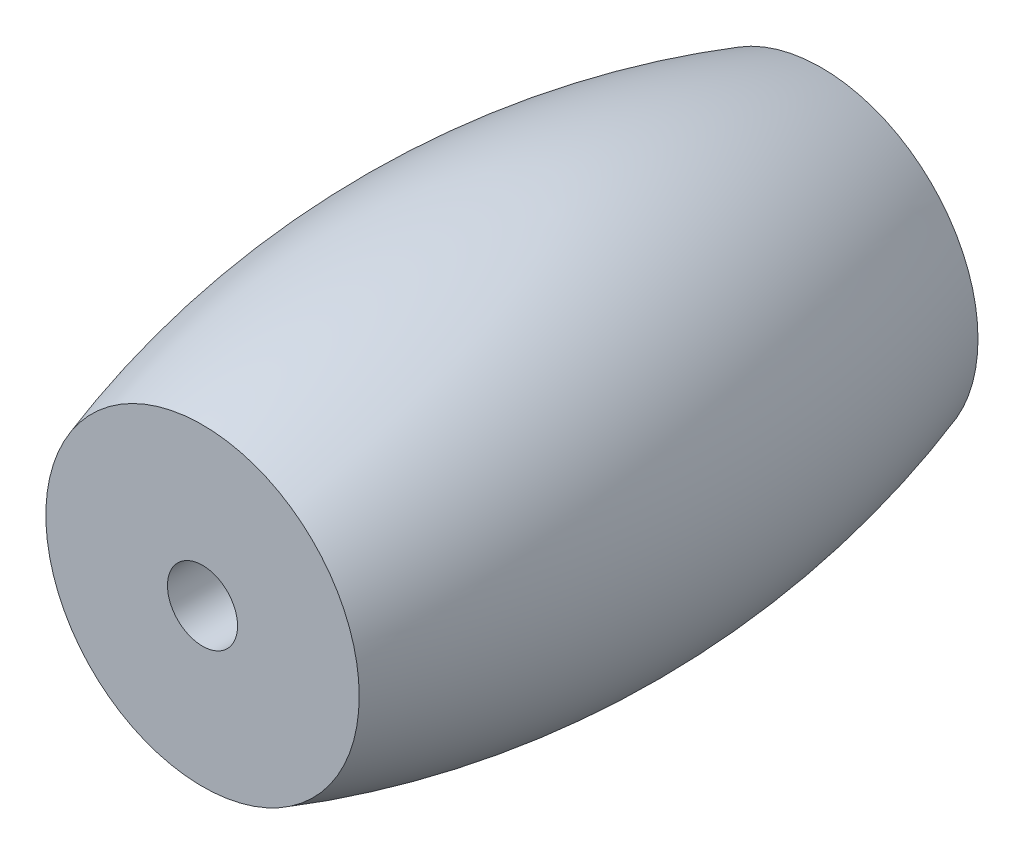
ISO-10303-21;
HEADER;
FILE_DESCRIPTION(('STEP AP214'),'2;1');
FILE_NAME('part.step','',(''),(''),'','','');
FILE_SCHEMA(('AUTOMOTIVE_DESIGN { 1 0 10303 214 1 1 1 1 }'));
ENDSEC;
DATA;
#1=APPLICATION_CONTEXT('core data for automotive mechanical design processes');
#2=APPLICATION_PROTOCOL_DEFINITION('international standard','automotive_design',2000,#1);
#3=PRODUCT_CONTEXT('',#1,'mechanical');
#4=PRODUCT('Part','Part','',(#3));
#5=PRODUCT_RELATED_PRODUCT_CATEGORY('part','',(#4));
#6=PRODUCT_DEFINITION_FORMATION('','',#4);
#7=PRODUCT_DEFINITION_CONTEXT('part definition',#1,'design');
#8=PRODUCT_DEFINITION('design','',#6,#7);
#9=PRODUCT_DEFINITION_SHAPE('','',#8);
#10=(LENGTH_UNIT() NAMED_UNIT(*) SI_UNIT(.MILLI.,.METRE.));
#11=(NAMED_UNIT(*) PLANE_ANGLE_UNIT() SI_UNIT($,.RADIAN.));
#12=(NAMED_UNIT(*) SI_UNIT($,.STERADIAN.) SOLID_ANGLE_UNIT());
#13=UNCERTAINTY_MEASURE_WITH_UNIT(LENGTH_MEASURE(1.E-05),#10,'distance_accuracy_value','');
#14=(GEOMETRIC_REPRESENTATION_CONTEXT(3) GLOBAL_UNCERTAINTY_ASSIGNED_CONTEXT((#13)) GLOBAL_UNIT_ASSIGNED_CONTEXT((#10,
#11,#12)) REPRESENTATION_CONTEXT('',''));
#15=CARTESIAN_POINT('',(0.,0.,0.));
#16=DIRECTION('',(0.,0.,1.));
#17=DIRECTION('',(1.,0.,0.));
#18=AXIS2_PLACEMENT_3D('',#15,#16,#17);
#19=CARTESIAN_POINT('',(0.,0.,-15.));
#20=DIRECTION('',(0.,0.,-1.));
#21=DIRECTION('',(-1.,0.,0.));
#22=AXIS2_PLACEMENT_3D('',#19,#20,#21);
#23=PLANE('',#22);
#24=CARTESIAN_POINT('',(0.,0.,-15.));
#25=DIRECTION('',(0.,0.,1.));
#26=DIRECTION('',(1.,0.,0.));
#27=AXIS2_PLACEMENT_3D('',#24,#25,#26);
#28=CIRCLE('',#27,1.7);
#29=CARTESIAN_POINT('',(1.7,0.,-15.));
#30=VERTEX_POINT('',#29);
#31=EDGE_CURVE('E62',#30,#30,#28,.T.);
#32=ORIENTED_EDGE('',*,*,#31,.T.);
#33=EDGE_LOOP('',(#32));
#34=FACE_BOUND('',#33,.T.);
#35=CARTESIAN_POINT('',(0.,0.,-15.));
#36=DIRECTION('',(0.,0.,1.));
#37=DIRECTION('',(1.,0.,0.));
#38=AXIS2_PLACEMENT_3D('',#35,#36,#37);
#39=CIRCLE('',#38,7.596052460712);
#40=CARTESIAN_POINT('',(7.596052460712,0.,-15.));
#41=VERTEX_POINT('',#40);
#42=EDGE_CURVE('E10',#41,#41,#39,.T.);
#43=ORIENTED_EDGE('',*,*,#42,.F.);
#44=EDGE_LOOP('',(#43));
#45=FACE_BOUND('',#44,.T.);
#46=ADVANCED_FACE('F41',(#34,#45),#23,.T.);
#47=CARTESIAN_POINT('',(0.,0.,0.));
#48=DIRECTION('',(0.,0.,1.));
#49=DIRECTION('',(1.,0.,0.));
#50=AXIS2_PLACEMENT_3D('',#47,#48,#49);
#51=DEGENERATE_TOROIDAL_SURFACE('',#50,38.,48.,.F.);
#52=CARTESIAN_POINT('',(0.,0.,15.));
#53=DIRECTION('',(0.,0.,1.));
#54=DIRECTION('',(1.,0.,0.));
#55=AXIS2_PLACEMENT_3D('',#52,#53,#54);
#56=CIRCLE('',#55,7.596052460712);
#57=CARTESIAN_POINT('',(7.596052460712,0.,15.));
#58=VERTEX_POINT('',#57);
#59=EDGE_CURVE('E48',#58,#58,#56,.T.);
#60=ORIENTED_EDGE('',*,*,#59,.F.);
#61=EDGE_LOOP('',(#60));
#62=FACE_BOUND('',#61,.T.);
#63=ORIENTED_EDGE('',*,*,#42,.T.);
#64=EDGE_LOOP('',(#63));
#65=FACE_BOUND('',#64,.T.);
#66=ADVANCED_FACE('F81',(#62,#65),#51,.F.);
#67=CARTESIAN_POINT('',(0.,0.,15.));
#68=DIRECTION('',(0.,0.,-1.));
#69=DIRECTION('',(-1.,0.,0.));
#70=AXIS2_PLACEMENT_3D('',#67,#68,#69);
#71=PLANE('',#70);
#72=CARTESIAN_POINT('',(0.,0.,15.));
#73=DIRECTION('',(0.,0.,1.));
#74=DIRECTION('',(1.,0.,0.));
#75=AXIS2_PLACEMENT_3D('',#72,#73,#74);
#76=CIRCLE('',#75,1.7);
#77=CARTESIAN_POINT('',(1.7,0.,15.));
#78=VERTEX_POINT('',#77);
#79=EDGE_CURVE('E55',#78,#78,#76,.T.);
#80=ORIENTED_EDGE('',*,*,#79,.F.);
#81=EDGE_LOOP('',(#80));
#82=FACE_BOUND('',#81,.T.);
#83=ORIENTED_EDGE('',*,*,#59,.T.);
#84=EDGE_LOOP('',(#83));
#85=FACE_BOUND('',#84,.T.);
#86=ADVANCED_FACE('F76',(#82,#85),#71,.F.);
#87=CARTESIAN_POINT('',(0.,0.,31.772981831551));
#88=DIRECTION('',(0.,0.,1.));
#89=DIRECTION('',(1.,0.,0.));
#90=AXIS2_PLACEMENT_3D('',#87,#88,#89);
#91=CYLINDRICAL_SURFACE('',#90,1.7);
#92=ORIENTED_EDGE('',*,*,#31,.F.);
#93=EDGE_LOOP('',(#92));
#94=FACE_BOUND('',#93,.T.);
#95=ORIENTED_EDGE('',*,*,#79,.T.);
#96=EDGE_LOOP('',(#95));
#97=FACE_BOUND('',#96,.T.);
#98=ADVANCED_FACE('F73',(#94,#97),#91,.F.);
#99=CLOSED_SHELL('',(#46,#66,#86,#98));
#100=MANIFOLD_SOLID_BREP('B2',#99);
#101=ADVANCED_BREP_SHAPE_REPRESENTATION('',(#18,#100),#14);
#102=SHAPE_DEFINITION_REPRESENTATION(#9,#101);
ENDSEC;
END-ISO-10303-21;
